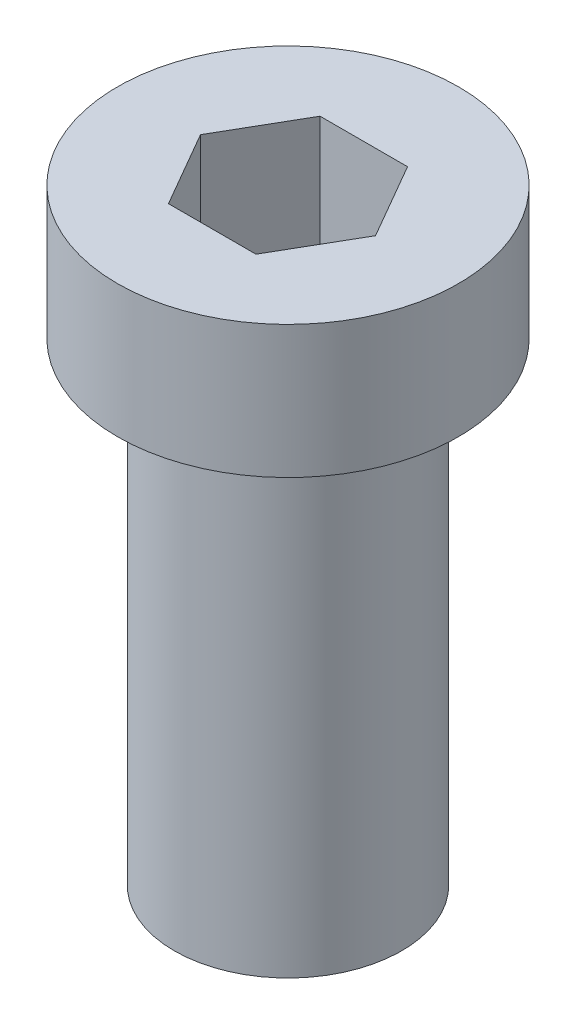
ISO-10303-21;
HEADER;
FILE_DESCRIPTION(('STEP AP214'),'2;1');
FILE_NAME('part.step','',(''),(''),'','','');
FILE_SCHEMA(('AUTOMOTIVE_DESIGN { 1 0 10303 214 1 1 1 1 }'));
ENDSEC;
DATA;
#1=APPLICATION_CONTEXT('core data for automotive mechanical design processes');
#2=APPLICATION_PROTOCOL_DEFINITION('international standard','automotive_design',2000,#1);
#3=PRODUCT_CONTEXT('',#1,'mechanical');
#4=PRODUCT('Part','Part','',(#3));
#5=PRODUCT_RELATED_PRODUCT_CATEGORY('part','',(#4));
#6=PRODUCT_DEFINITION_FORMATION('','',#4);
#7=PRODUCT_DEFINITION_CONTEXT('part definition',#1,'design');
#8=PRODUCT_DEFINITION('design','',#6,#7);
#9=PRODUCT_DEFINITION_SHAPE('','',#8);
#10=(LENGTH_UNIT() NAMED_UNIT(*) SI_UNIT(.MILLI.,.METRE.));
#11=(NAMED_UNIT(*) PLANE_ANGLE_UNIT() SI_UNIT($,.RADIAN.));
#12=(NAMED_UNIT(*) SI_UNIT($,.STERADIAN.) SOLID_ANGLE_UNIT());
#13=UNCERTAINTY_MEASURE_WITH_UNIT(LENGTH_MEASURE(1.E-05),#10,'distance_accuracy_value','');
#14=(GEOMETRIC_REPRESENTATION_CONTEXT(3) GLOBAL_UNCERTAINTY_ASSIGNED_CONTEXT((#13)) GLOBAL_UNIT_ASSIGNED_CONTEXT((#10,
#11,#12)) REPRESENTATION_CONTEXT('',''));
#15=CARTESIAN_POINT('',(0.,0.,0.));
#16=DIRECTION('',(0.,0.,1.));
#17=DIRECTION('',(1.,0.,0.));
#18=AXIS2_PLACEMENT_3D('',#15,#16,#17);
#19=CARTESIAN_POINT('',(9.00000000000001,7.,0.));
#20=DIRECTION('',(0.,-1.,0.));
#21=DIRECTION('',(0.,0.,-1.));
#22=AXIS2_PLACEMENT_3D('',#19,#20,#21);
#23=PLANE('',#22);
#24=DIRECTION('',(-1.,0.,0.));
#25=VECTOR('',#24,1.);
#26=CARTESIAN_POINT('',(2.3094010767585,7.,-4.));
#27=LINE('',#26,#25);
#28=CARTESIAN_POINT('',(2.3094010767585,7.,-4.));
#29=VERTEX_POINT('',#28);
#30=CARTESIAN_POINT('',(-2.3094010767585,7.,-4.));
#31=VERTEX_POINT('',#30);
#32=EDGE_CURVE('E136',#29,#31,#27,.T.);
#33=ORIENTED_EDGE('',*,*,#32,.F.);
#34=DIRECTION('',(-0.5,0.,-0.866025403784439));
#35=VECTOR('',#34,1.);
#36=CARTESIAN_POINT('',(4.61880215351701,7.,0.));
#37=LINE('',#36,#35);
#38=CARTESIAN_POINT('',(4.61880215351701,7.,0.));
#39=VERTEX_POINT('',#38);
#40=EDGE_CURVE('E62',#39,#29,#37,.T.);
#41=ORIENTED_EDGE('',*,*,#40,.F.);
#42=DIRECTION('',(0.5,0.,-0.866025403784439));
#43=VECTOR('',#42,1.);
#44=CARTESIAN_POINT('',(2.3094010767585,7.,4.));
#45=LINE('',#44,#43);
#46=CARTESIAN_POINT('',(2.3094010767585,7.,4.));
#47=VERTEX_POINT('',#46);
#48=EDGE_CURVE('E145',#47,#39,#45,.T.);
#49=ORIENTED_EDGE('',*,*,#48,.F.);
#50=DIRECTION('',(1.,0.,0.));
#51=VECTOR('',#50,1.);
#52=CARTESIAN_POINT('',(-2.3094010767585,7.,4.));
#53=LINE('',#52,#51);
#54=CARTESIAN_POINT('',(-2.3094010767585,7.,4.));
#55=VERTEX_POINT('',#54);
#56=EDGE_CURVE('E143',#55,#47,#53,.T.);
#57=ORIENTED_EDGE('',*,*,#56,.F.);
#58=DIRECTION('',(0.5,0.,0.866025403784438));
#59=VECTOR('',#58,1.);
#60=CARTESIAN_POINT('',(-4.61880215351701,7.,0.));
#61=LINE('',#60,#59);
#62=CARTESIAN_POINT('',(-4.61880215351701,7.,0.));
#63=VERTEX_POINT('',#62);
#64=EDGE_CURVE('E110',#63,#55,#61,.T.);
#65=ORIENTED_EDGE('',*,*,#64,.F.);
#66=DIRECTION('',(-0.5,0.,0.866025403784439));
#67=VECTOR('',#66,1.);
#68=CARTESIAN_POINT('',(-2.3094010767585,7.,-4.));
#69=LINE('',#68,#67);
#70=EDGE_CURVE('E139',#31,#63,#69,.T.);
#71=ORIENTED_EDGE('',*,*,#70,.F.);
#72=EDGE_LOOP('',(#33,#41,#49,#57,#65,#71));
#73=FACE_BOUND('',#72,.T.);
#74=CARTESIAN_POINT('',(0.,7.,0.));
#75=DIRECTION('',(0.,1.,0.));
#76=DIRECTION('',(0.,0.,1.));
#77=AXIS2_PLACEMENT_3D('',#74,#75,#76);
#78=CIRCLE('',#77,9.00000000000001);
#79=CARTESIAN_POINT('',(0.,7.,9.00000000000001));
#80=VERTEX_POINT('',#79);
#81=EDGE_CURVE('E13',#80,#80,#78,.T.);
#82=ORIENTED_EDGE('',*,*,#81,.T.);
#83=EDGE_LOOP('',(#82));
#84=FACE_BOUND('',#83,.T.);
#85=ADVANCED_FACE('F48',(#73,#84),#23,.F.);
#86=CARTESIAN_POINT('',(0.,61.6916426261037,0.));
#87=DIRECTION('',(0.,1.,0.));
#88=DIRECTION('',(0.,0.,1.));
#89=AXIS2_PLACEMENT_3D('',#86,#87,#88);
#90=CYLINDRICAL_SURFACE('',#89,9.00000000000001);
#91=ORIENTED_EDGE('',*,*,#81,.F.);
#92=EDGE_LOOP('',(#91));
#93=FACE_BOUND('',#92,.T.);
#94=CARTESIAN_POINT('',(0.,0.,0.));
#95=DIRECTION('',(0.,1.,0.));
#96=DIRECTION('',(0.,0.,1.));
#97=AXIS2_PLACEMENT_3D('',#94,#95,#96);
#98=CIRCLE('',#97,9.00000000000001);
#99=CARTESIAN_POINT('',(0.,0.,9.00000000000001));
#100=VERTEX_POINT('',#99);
#101=EDGE_CURVE('E55',#100,#100,#98,.T.);
#102=ORIENTED_EDGE('',*,*,#101,.T.);
#103=EDGE_LOOP('',(#102));
#104=FACE_BOUND('',#103,.T.);
#105=ADVANCED_FACE('F162',(#93,#104),#90,.T.);
#106=CARTESIAN_POINT('',(6.00000000000001,0.,0.));
#107=DIRECTION('',(0.,1.,0.));
#108=DIRECTION('',(0.,0.,1.));
#109=AXIS2_PLACEMENT_3D('',#106,#107,#108);
#110=PLANE('',#109);
#111=ORIENTED_EDGE('',*,*,#101,.F.);
#112=EDGE_LOOP('',(#111));
#113=FACE_BOUND('',#112,.T.);
#114=CARTESIAN_POINT('',(0.,0.,0.));
#115=DIRECTION('',(0.,1.,0.));
#116=DIRECTION('',(0.,0.,1.));
#117=AXIS2_PLACEMENT_3D('',#114,#115,#116);
#118=CIRCLE('',#117,6.00000000000001);
#119=CARTESIAN_POINT('',(0.,0.,6.00000000000001));
#120=VERTEX_POINT('',#119);
#121=EDGE_CURVE('E157',#120,#120,#118,.T.);
#122=ORIENTED_EDGE('',*,*,#121,.T.);
#123=EDGE_LOOP('',(#122));
#124=FACE_BOUND('',#123,.T.);
#125=ADVANCED_FACE('F164',(#113,#124),#110,.F.);
#126=CARTESIAN_POINT('',(0.,61.6916426261037,0.));
#127=DIRECTION('',(0.,1.,0.));
#128=DIRECTION('',(0.,0.,1.));
#129=AXIS2_PLACEMENT_3D('',#126,#127,#128);
#130=CYLINDRICAL_SURFACE('',#129,6.00000000000001);
#131=ORIENTED_EDGE('',*,*,#121,.F.);
#132=EDGE_LOOP('',(#131));
#133=FACE_BOUND('',#132,.T.);
#134=CARTESIAN_POINT('',(0.,-25.,0.));
#135=DIRECTION('',(0.,1.,0.));
#136=DIRECTION('',(0.,0.,1.));
#137=AXIS2_PLACEMENT_3D('',#134,#135,#136);
#138=CIRCLE('',#137,6.00000000000001);
#139=CARTESIAN_POINT('',(0.,-25.,6.00000000000001));
#140=VERTEX_POINT('',#139);
#141=EDGE_CURVE('E149',#140,#140,#138,.T.);
#142=ORIENTED_EDGE('',*,*,#141,.T.);
#143=EDGE_LOOP('',(#142));
#144=FACE_BOUND('',#143,.T.);
#145=ADVANCED_FACE('F167',(#133,#144),#130,.T.);
#146=CARTESIAN_POINT('',(0.,-25.,0.));
#147=DIRECTION('',(0.,1.,0.));
#148=DIRECTION('',(0.,0.,1.));
#149=AXIS2_PLACEMENT_3D('',#146,#147,#148);
#150=PLANE('',#149);
#151=ORIENTED_EDGE('',*,*,#141,.F.);
#152=EDGE_LOOP('',(#151));
#153=FACE_BOUND('',#152,.T.);
#154=ADVANCED_FACE('F173',(#153),#150,.F.);
#155=CARTESIAN_POINT('',(4.61880215351701,0.999999999999999,0.));
#156=DIRECTION('',(0.866025403784439,0.,-0.5));
#157=DIRECTION('',(-0.5,0.,-0.866025403784439));
#158=AXIS2_PLACEMENT_3D('',#155,#156,#157);
#159=PLANE('',#158);
#160=ORIENTED_EDGE('',*,*,#40,.T.);
#161=DIRECTION('',(0.,1.,0.));
#162=VECTOR('',#161,1.);
#163=CARTESIAN_POINT('',(2.3094010767585,0.999999999999999,-4.));
#164=LINE('',#163,#162);
#165=CARTESIAN_POINT('',(2.3094010767585,0.999999999999999,-4.));
#166=VERTEX_POINT('',#165);
#167=EDGE_CURVE('E92',#166,#29,#164,.T.);
#168=ORIENTED_EDGE('',*,*,#167,.F.);
#169=DIRECTION('',(-0.5,0.,-0.866025403784439));
#170=VECTOR('',#169,1.);
#171=CARTESIAN_POINT('',(4.61880215351701,0.999999999999999,0.));
#172=LINE('',#171,#170);
#173=CARTESIAN_POINT('',(4.61880215351701,0.999999999999999,0.));
#174=VERTEX_POINT('',#173);
#175=EDGE_CURVE('E147',#174,#166,#172,.T.);
#176=ORIENTED_EDGE('',*,*,#175,.F.);
#177=DIRECTION('',(0.,1.,0.));
#178=VECTOR('',#177,1.);
#179=CARTESIAN_POINT('',(4.61880215351701,0.999999999999999,0.));
#180=LINE('',#179,#178);
#181=EDGE_CURVE('E70',#174,#39,#180,.T.);
#182=ORIENTED_EDGE('',*,*,#181,.T.);
#183=EDGE_LOOP('',(#160,#168,#176,#182));
#184=FACE_BOUND('',#183,.T.);
#185=ADVANCED_FACE('F178',(#184),#159,.F.);
#186=CARTESIAN_POINT('',(2.3094010767585,0.999999999999999,4.));
#187=DIRECTION('',(0.866025403784439,0.,0.5));
#188=DIRECTION('',(0.5,0.,-0.866025403784439));
#189=AXIS2_PLACEMENT_3D('',#186,#187,#188);
#190=PLANE('',#189);
#191=ORIENTED_EDGE('',*,*,#48,.T.);
#192=ORIENTED_EDGE('',*,*,#181,.F.);
#193=DIRECTION('',(0.5,0.,-0.866025403784439));
#194=VECTOR('',#193,1.);
#195=CARTESIAN_POINT('',(2.3094010767585,0.999999999999999,4.));
#196=LINE('',#195,#194);
#197=CARTESIAN_POINT('',(2.3094010767585,0.999999999999999,4.));
#198=VERTEX_POINT('',#197);
#199=EDGE_CURVE('E122',#198,#174,#196,.T.);
#200=ORIENTED_EDGE('',*,*,#199,.F.);
#201=DIRECTION('',(0.,1.,0.));
#202=VECTOR('',#201,1.);
#203=CARTESIAN_POINT('',(2.3094010767585,0.999999999999999,4.));
#204=LINE('',#203,#202);
#205=EDGE_CURVE('E114',#198,#47,#204,.T.);
#206=ORIENTED_EDGE('',*,*,#205,.T.);
#207=EDGE_LOOP('',(#191,#192,#200,#206));
#208=FACE_BOUND('',#207,.T.);
#209=ADVANCED_FACE('F183',(#208),#190,.F.);
#210=CARTESIAN_POINT('',(-2.3094010767585,0.999999999999999,4.));
#211=DIRECTION('',(0.,0.,1.));
#212=DIRECTION('',(1.,0.,0.));
#213=AXIS2_PLACEMENT_3D('',#210,#211,#212);
#214=PLANE('',#213);
#215=ORIENTED_EDGE('',*,*,#56,.T.);
#216=ORIENTED_EDGE('',*,*,#205,.F.);
#217=DIRECTION('',(1.,0.,0.));
#218=VECTOR('',#217,1.);
#219=CARTESIAN_POINT('',(-2.3094010767585,0.999999999999999,4.));
#220=LINE('',#219,#218);
#221=CARTESIAN_POINT('',(-2.3094010767585,0.999999999999999,4.));
#222=VERTEX_POINT('',#221);
#223=EDGE_CURVE('E118',#222,#198,#220,.T.);
#224=ORIENTED_EDGE('',*,*,#223,.F.);
#225=DIRECTION('',(0.,1.,0.));
#226=VECTOR('',#225,1.);
#227=CARTESIAN_POINT('',(-2.3094010767585,0.999999999999999,4.));
#228=LINE('',#227,#226);
#229=EDGE_CURVE('E103',#222,#55,#228,.T.);
#230=ORIENTED_EDGE('',*,*,#229,.T.);
#231=EDGE_LOOP('',(#215,#216,#224,#230));
#232=FACE_BOUND('',#231,.T.);
#233=ADVANCED_FACE('F119',(#232),#214,.F.);
#234=CARTESIAN_POINT('',(-4.61880215351701,0.999999999999999,0.));
#235=DIRECTION('',(-0.866025403784438,0.,0.5));
#236=DIRECTION('',(0.5,0.,0.866025403784438));
#237=AXIS2_PLACEMENT_3D('',#234,#235,#236);
#238=PLANE('',#237);
#239=ORIENTED_EDGE('',*,*,#64,.T.);
#240=ORIENTED_EDGE('',*,*,#229,.F.);
#241=DIRECTION('',(0.5,0.,0.866025403784438));
#242=VECTOR('',#241,1.);
#243=CARTESIAN_POINT('',(-4.61880215351701,0.999999999999999,0.));
#244=LINE('',#243,#242);
#245=CARTESIAN_POINT('',(-4.61880215351701,0.999999999999999,0.));
#246=VERTEX_POINT('',#245);
#247=EDGE_CURVE('E107',#246,#222,#244,.T.);
#248=ORIENTED_EDGE('',*,*,#247,.F.);
#249=DIRECTION('',(0.,1.,0.));
#250=VECTOR('',#249,1.);
#251=CARTESIAN_POINT('',(-4.61880215351701,0.999999999999999,0.));
#252=LINE('',#251,#250);
#253=EDGE_CURVE('E115',#246,#63,#252,.T.);
#254=ORIENTED_EDGE('',*,*,#253,.T.);
#255=EDGE_LOOP('',(#239,#240,#248,#254));
#256=FACE_BOUND('',#255,.T.);
#257=ADVANCED_FACE('F105',(#256),#238,.F.);
#258=CARTESIAN_POINT('',(-2.3094010767585,0.999999999999999,-4.));
#259=DIRECTION('',(-0.866025403784439,0.,-0.5));
#260=DIRECTION('',(-0.5,0.,0.866025403784439));
#261=AXIS2_PLACEMENT_3D('',#258,#259,#260);
#262=PLANE('',#261);
#263=ORIENTED_EDGE('',*,*,#70,.T.);
#264=ORIENTED_EDGE('',*,*,#253,.F.);
#265=DIRECTION('',(-0.5,0.,0.866025403784439));
#266=VECTOR('',#265,1.);
#267=CARTESIAN_POINT('',(-2.3094010767585,0.999999999999999,-4.));
#268=LINE('',#267,#266);
#269=CARTESIAN_POINT('',(-2.3094010767585,0.999999999999999,-4.));
#270=VERTEX_POINT('',#269);
#271=EDGE_CURVE('E128',#270,#246,#268,.T.);
#272=ORIENTED_EDGE('',*,*,#271,.F.);
#273=DIRECTION('',(0.,1.,0.));
#274=VECTOR('',#273,1.);
#275=CARTESIAN_POINT('',(-2.3094010767585,0.999999999999999,-4.));
#276=LINE('',#275,#274);
#277=EDGE_CURVE('E152',#270,#31,#276,.T.);
#278=ORIENTED_EDGE('',*,*,#277,.T.);
#279=EDGE_LOOP('',(#263,#264,#272,#278));
#280=FACE_BOUND('',#279,.T.);
#281=ADVANCED_FACE('F209',(#280),#262,.F.);
#282=CARTESIAN_POINT('',(2.3094010767585,0.999999999999999,-4.));
#283=DIRECTION('',(0.,0.,-1.));
#284=DIRECTION('',(-1.,0.,0.));
#285=AXIS2_PLACEMENT_3D('',#282,#283,#284);
#286=PLANE('',#285);
#287=ORIENTED_EDGE('',*,*,#32,.T.);
#288=ORIENTED_EDGE('',*,*,#277,.F.);
#289=DIRECTION('',(-1.,0.,0.));
#290=VECTOR('',#289,1.);
#291=CARTESIAN_POINT('',(2.3094010767585,0.999999999999999,-4.));
#292=LINE('',#291,#290);
#293=EDGE_CURVE('E130',#166,#270,#292,.T.);
#294=ORIENTED_EDGE('',*,*,#293,.F.);
#295=ORIENTED_EDGE('',*,*,#167,.T.);
#296=EDGE_LOOP('',(#287,#288,#294,#295));
#297=FACE_BOUND('',#296,.T.);
#298=ADVANCED_FACE('F197',(#297),#286,.F.);
#299=CARTESIAN_POINT('',(2.3094010767585,0.999999999999999,-4.));
#300=DIRECTION('',(0.,1.,0.));
#301=DIRECTION('',(0.,0.,1.));
#302=AXIS2_PLACEMENT_3D('',#299,#300,#301);
#303=PLANE('',#302);
#304=ORIENTED_EDGE('',*,*,#175,.T.);
#305=ORIENTED_EDGE('',*,*,#293,.T.);
#306=ORIENTED_EDGE('',*,*,#271,.T.);
#307=ORIENTED_EDGE('',*,*,#247,.T.);
#308=ORIENTED_EDGE('',*,*,#223,.T.);
#309=ORIENTED_EDGE('',*,*,#199,.T.);
#310=EDGE_LOOP('',(#304,#305,#306,#307,#308,#309));
#311=FACE_BOUND('',#310,.T.);
#312=ADVANCED_FACE('F125',(#311),#303,.T.);
#313=CLOSED_SHELL('',(#85,#105,#125,#145,#154,#185,#209,#233,#257,#281,#298,#312));
#314=MANIFOLD_SOLID_BREP('B2',#313);
#315=ADVANCED_BREP_SHAPE_REPRESENTATION('',(#18,#314),#14);
#316=SHAPE_DEFINITION_REPRESENTATION(#9,#315);
ENDSEC;
END-ISO-10303-21;
